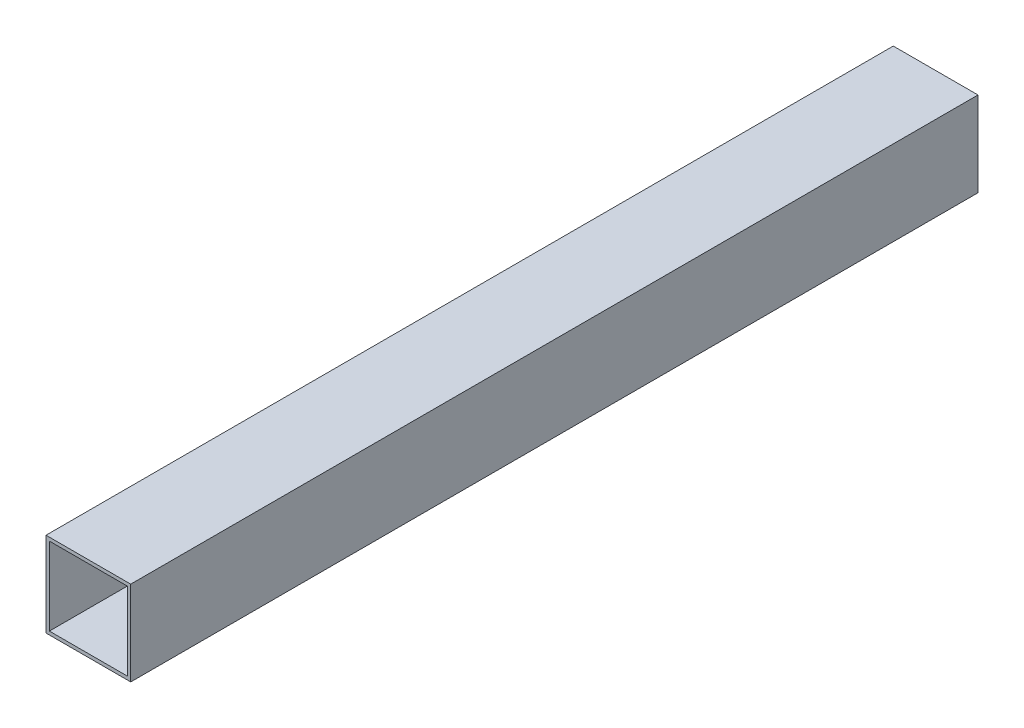
ISO-10303-21;
HEADER;
FILE_DESCRIPTION(('STEP AP214'),'2;1');
FILE_NAME('part.step','',(''),(''),'','','');
FILE_SCHEMA(('AUTOMOTIVE_DESIGN { 1 0 10303 214 1 1 1 1 }'));
ENDSEC;
DATA;
#1=APPLICATION_CONTEXT('core data for automotive mechanical design processes');
#2=APPLICATION_PROTOCOL_DEFINITION('international standard','automotive_design',2000,#1);
#3=PRODUCT_CONTEXT('',#1,'mechanical');
#4=PRODUCT('Part','Part','',(#3));
#5=PRODUCT_RELATED_PRODUCT_CATEGORY('part','',(#4));
#6=PRODUCT_DEFINITION_FORMATION('','',#4);
#7=PRODUCT_DEFINITION_CONTEXT('part definition',#1,'design');
#8=PRODUCT_DEFINITION('design','',#6,#7);
#9=PRODUCT_DEFINITION_SHAPE('','',#8);
#10=(LENGTH_UNIT() NAMED_UNIT(*) SI_UNIT(.MILLI.,.METRE.));
#11=(NAMED_UNIT(*) PLANE_ANGLE_UNIT() SI_UNIT($,.RADIAN.));
#12=(NAMED_UNIT(*) SI_UNIT($,.STERADIAN.) SOLID_ANGLE_UNIT());
#13=UNCERTAINTY_MEASURE_WITH_UNIT(LENGTH_MEASURE(1.E-05),#10,'distance_accuracy_value','');
#14=(GEOMETRIC_REPRESENTATION_CONTEXT(3) GLOBAL_UNCERTAINTY_ASSIGNED_CONTEXT((#13)) GLOBAL_UNIT_ASSIGNED_CONTEXT((#10,
#11,#12)) REPRESENTATION_CONTEXT('',''));
#15=CARTESIAN_POINT('',(0.,0.,0.));
#16=DIRECTION('',(0.,0.,1.));
#17=DIRECTION('',(1.,0.,0.));
#18=AXIS2_PLACEMENT_3D('',#15,#16,#17);
#19=CARTESIAN_POINT('',(-107.863012306017,-68.6292580101181,1000.));
#20=DIRECTION('',(0.,0.,1.));
#21=DIRECTION('',(1.,0.,0.));
#22=AXIS2_PLACEMENT_3D('',#19,#20,#21);
#23=PLANE('',#22);
#24=DIRECTION('',(0.,-1.,0.));
#25=VECTOR('',#24,1.);
#26=CARTESIAN_POINT('',(-107.863012306017,31.370741989882,1000.));
#27=LINE('',#26,#25);
#28=CARTESIAN_POINT('',(-107.863012306017,31.370741989882,1000.));
#29=VERTEX_POINT('',#28);
#30=CARTESIAN_POINT('',(-107.863012306017,-68.6292580101181,1000.));
#31=VERTEX_POINT('',#30);
#32=EDGE_CURVE('E133',#29,#31,#27,.T.);
#33=ORIENTED_EDGE('',*,*,#32,.T.);
#34=DIRECTION('',(1.,0.,0.));
#35=VECTOR('',#34,1.);
#36=CARTESIAN_POINT('',(-107.863012306017,-68.6292580101181,1000.));
#37=LINE('',#36,#35);
#38=CARTESIAN_POINT('',(-7.86301230601749,-68.6292580101181,1000.));
#39=VERTEX_POINT('',#38);
#40=EDGE_CURVE('E136',#31,#39,#37,.T.);
#41=ORIENTED_EDGE('',*,*,#40,.T.);
#42=DIRECTION('',(0.,1.,0.));
#43=VECTOR('',#42,1.);
#44=CARTESIAN_POINT('',(-7.86301230601749,31.370741989882,1000.));
#45=LINE('',#44,#43);
#46=CARTESIAN_POINT('',(-7.86301230601749,31.370741989882,1000.));
#47=VERTEX_POINT('',#46);
#48=EDGE_CURVE('E139',#39,#47,#45,.T.);
#49=ORIENTED_EDGE('',*,*,#48,.T.);
#50=DIRECTION('',(-1.,0.,0.));
#51=VECTOR('',#50,1.);
#52=CARTESIAN_POINT('',(-107.863012306017,31.370741989882,1000.));
#53=LINE('',#52,#51);
#54=EDGE_CURVE('E141',#47,#29,#53,.T.);
#55=ORIENTED_EDGE('',*,*,#54,.T.);
#56=EDGE_LOOP('',(#33,#41,#49,#55));
#57=FACE_BOUND('',#56,.T.);
#58=DIRECTION('',(1.,0.,0.));
#59=VECTOR('',#58,1.);
#60=CARTESIAN_POINT('',(-103.863012306017,-64.629258010118,1000.));
#61=LINE('',#60,#59);
#62=CARTESIAN_POINT('',(-103.863012306017,-64.629258010118,1000.));
#63=VERTEX_POINT('',#62);
#64=CARTESIAN_POINT('',(-11.8630123060175,-64.629258010118,1000.));
#65=VERTEX_POINT('',#64);
#66=EDGE_CURVE('E105',#63,#65,#61,.T.);
#67=ORIENTED_EDGE('',*,*,#66,.F.);
#68=DIRECTION('',(0.,-1.,0.));
#69=VECTOR('',#68,1.);
#70=CARTESIAN_POINT('',(-103.863012306017,27.370741989882,1000.));
#71=LINE('',#70,#69);
#72=CARTESIAN_POINT('',(-103.863012306017,27.370741989882,1000.));
#73=VERTEX_POINT('',#72);
#74=EDGE_CURVE('E97',#73,#63,#71,.T.);
#75=ORIENTED_EDGE('',*,*,#74,.F.);
#76=DIRECTION('',(-1.,0.,0.));
#77=VECTOR('',#76,1.);
#78=CARTESIAN_POINT('',(-103.863012306017,27.370741989882,1000.));
#79=LINE('',#78,#77);
#80=CARTESIAN_POINT('',(-11.8630123060175,27.370741989882,1000.));
#81=VERTEX_POINT('',#80);
#82=EDGE_CURVE('E119',#81,#73,#79,.T.);
#83=ORIENTED_EDGE('',*,*,#82,.F.);
#84=DIRECTION('',(0.,1.,0.));
#85=VECTOR('',#84,1.);
#86=CARTESIAN_POINT('',(-11.8630123060175,27.370741989882,1000.));
#87=LINE('',#86,#85);
#88=EDGE_CURVE('E117',#65,#81,#87,.T.);
#89=ORIENTED_EDGE('',*,*,#88,.F.);
#90=EDGE_LOOP('',(#67,#75,#83,#89));
#91=FACE_BOUND('',#90,.T.);
#92=ADVANCED_FACE('F32',(#57,#91),#23,.T.);
#93=CARTESIAN_POINT('',(-107.863012306017,-68.6292580101181,0.));
#94=DIRECTION('',(0.,0.,1.));
#95=DIRECTION('',(1.,0.,0.));
#96=AXIS2_PLACEMENT_3D('',#93,#94,#95);
#97=PLANE('',#96);
#98=DIRECTION('',(0.,-1.,0.));
#99=VECTOR('',#98,1.);
#100=CARTESIAN_POINT('',(-107.863012306017,31.370741989882,0.));
#101=LINE('',#100,#99);
#102=CARTESIAN_POINT('',(-107.863012306017,31.370741989882,0.));
#103=VERTEX_POINT('',#102);
#104=CARTESIAN_POINT('',(-107.863012306017,-68.6292580101181,0.));
#105=VERTEX_POINT('',#104);
#106=EDGE_CURVE('E113',#103,#105,#101,.T.);
#107=ORIENTED_EDGE('',*,*,#106,.F.);
#108=DIRECTION('',(-1.,0.,0.));
#109=VECTOR('',#108,1.);
#110=CARTESIAN_POINT('',(-107.863012306017,31.370741989882,0.));
#111=LINE('',#110,#109);
#112=CARTESIAN_POINT('',(-7.86301230601749,31.370741989882,0.));
#113=VERTEX_POINT('',#112);
#114=EDGE_CURVE('E137',#113,#103,#111,.T.);
#115=ORIENTED_EDGE('',*,*,#114,.F.);
#116=DIRECTION('',(0.,1.,0.));
#117=VECTOR('',#116,1.);
#118=CARTESIAN_POINT('',(-7.86301230601749,31.370741989882,0.));
#119=LINE('',#118,#117);
#120=CARTESIAN_POINT('',(-7.86301230601749,-68.6292580101181,0.));
#121=VERTEX_POINT('',#120);
#122=EDGE_CURVE('E148',#121,#113,#119,.T.);
#123=ORIENTED_EDGE('',*,*,#122,.F.);
#124=DIRECTION('',(1.,0.,0.));
#125=VECTOR('',#124,1.);
#126=CARTESIAN_POINT('',(-107.863012306017,-68.6292580101181,0.));
#127=LINE('',#126,#125);
#128=EDGE_CURVE('E146',#105,#121,#127,.T.);
#129=ORIENTED_EDGE('',*,*,#128,.F.);
#130=EDGE_LOOP('',(#107,#115,#123,#129));
#131=FACE_BOUND('',#130,.T.);
#132=DIRECTION('',(0.,-1.,0.));
#133=VECTOR('',#132,1.);
#134=CARTESIAN_POINT('',(-103.863012306017,27.370741989882,0.));
#135=LINE('',#134,#133);
#136=CARTESIAN_POINT('',(-103.863012306017,27.370741989882,0.));
#137=VERTEX_POINT('',#136);
#138=CARTESIAN_POINT('',(-103.863012306017,-64.629258010118,0.));
#139=VERTEX_POINT('',#138);
#140=EDGE_CURVE('E55',#137,#139,#135,.T.);
#141=ORIENTED_EDGE('',*,*,#140,.T.);
#142=DIRECTION('',(1.,0.,0.));
#143=VECTOR('',#142,1.);
#144=CARTESIAN_POINT('',(-103.863012306017,-64.629258010118,0.));
#145=LINE('',#144,#143);
#146=CARTESIAN_POINT('',(-11.8630123060175,-64.629258010118,0.));
#147=VERTEX_POINT('',#146);
#148=EDGE_CURVE('E112',#139,#147,#145,.T.);
#149=ORIENTED_EDGE('',*,*,#148,.T.);
#150=DIRECTION('',(0.,1.,0.));
#151=VECTOR('',#150,1.);
#152=CARTESIAN_POINT('',(-11.8630123060175,27.370741989882,0.));
#153=LINE('',#152,#151);
#154=CARTESIAN_POINT('',(-11.8630123060175,27.370741989882,0.));
#155=VERTEX_POINT('',#154);
#156=EDGE_CURVE('E125',#147,#155,#153,.T.);
#157=ORIENTED_EDGE('',*,*,#156,.T.);
#158=DIRECTION('',(-1.,0.,0.));
#159=VECTOR('',#158,1.);
#160=CARTESIAN_POINT('',(-103.863012306017,27.370741989882,0.));
#161=LINE('',#160,#159);
#162=EDGE_CURVE('E106',#155,#137,#161,.T.);
#163=ORIENTED_EDGE('',*,*,#162,.T.);
#164=EDGE_LOOP('',(#141,#149,#157,#163));
#165=FACE_BOUND('',#164,.T.);
#166=ADVANCED_FACE('F166',(#131,#165),#97,.F.);
#167=CARTESIAN_POINT('',(-107.863012306017,31.370741989882,1000.));
#168=DIRECTION('',(1.,0.,0.));
#169=DIRECTION('',(0.,1.,0.));
#170=AXIS2_PLACEMENT_3D('',#167,#168,#169);
#171=PLANE('',#170);
#172=ORIENTED_EDGE('',*,*,#106,.T.);
#173=DIRECTION('',(0.,0.,-1.));
#174=VECTOR('',#173,1.);
#175=CARTESIAN_POINT('',(-107.863012306017,-68.6292580101181,1000.));
#176=LINE('',#175,#174);
#177=EDGE_CURVE('E11',#31,#105,#176,.T.);
#178=ORIENTED_EDGE('',*,*,#177,.F.);
#179=ORIENTED_EDGE('',*,*,#32,.F.);
#180=DIRECTION('',(0.,0.,-1.));
#181=VECTOR('',#180,1.);
#182=CARTESIAN_POINT('',(-107.863012306017,31.370741989882,1000.));
#183=LINE('',#182,#181);
#184=EDGE_CURVE('E143',#29,#103,#183,.T.);
#185=ORIENTED_EDGE('',*,*,#184,.T.);
#186=EDGE_LOOP('',(#172,#178,#179,#185));
#187=FACE_BOUND('',#186,.T.);
#188=ADVANCED_FACE('F34',(#187),#171,.F.);
#189=CARTESIAN_POINT('',(-107.863012306017,-68.6292580101181,1000.));
#190=DIRECTION('',(0.,1.,0.));
#191=DIRECTION('',(0.,0.,1.));
#192=AXIS2_PLACEMENT_3D('',#189,#190,#191);
#193=PLANE('',#192);
#194=ORIENTED_EDGE('',*,*,#128,.T.);
#195=DIRECTION('',(0.,0.,-1.));
#196=VECTOR('',#195,1.);
#197=CARTESIAN_POINT('',(-7.86301230601749,-68.6292580101181,1000.));
#198=LINE('',#197,#196);
#199=EDGE_CURVE('E40',#39,#121,#198,.T.);
#200=ORIENTED_EDGE('',*,*,#199,.F.);
#201=ORIENTED_EDGE('',*,*,#40,.F.);
#202=ORIENTED_EDGE('',*,*,#177,.T.);
#203=EDGE_LOOP('',(#194,#200,#201,#202));
#204=FACE_BOUND('',#203,.T.);
#205=ADVANCED_FACE('F176',(#204),#193,.F.);
#206=CARTESIAN_POINT('',(-7.86301230601749,31.370741989882,1000.));
#207=DIRECTION('',(-1.,0.,0.));
#208=DIRECTION('',(0.,0.,1.));
#209=AXIS2_PLACEMENT_3D('',#206,#207,#208);
#210=PLANE('',#209);
#211=ORIENTED_EDGE('',*,*,#122,.T.);
#212=DIRECTION('',(0.,0.,-1.));
#213=VECTOR('',#212,1.);
#214=CARTESIAN_POINT('',(-7.86301230601749,31.370741989882,1000.));
#215=LINE('',#214,#213);
#216=EDGE_CURVE('E153',#47,#113,#215,.T.);
#217=ORIENTED_EDGE('',*,*,#216,.F.);
#218=ORIENTED_EDGE('',*,*,#48,.F.);
#219=ORIENTED_EDGE('',*,*,#199,.T.);
#220=EDGE_LOOP('',(#211,#217,#218,#219));
#221=FACE_BOUND('',#220,.T.);
#222=ADVANCED_FACE('F160',(#221),#210,.F.);
#223=CARTESIAN_POINT('',(-107.863012306017,31.370741989882,1000.));
#224=DIRECTION('',(0.,-1.,0.));
#225=DIRECTION('',(1.,0.,0.));
#226=AXIS2_PLACEMENT_3D('',#223,#224,#225);
#227=PLANE('',#226);
#228=ORIENTED_EDGE('',*,*,#114,.T.);
#229=ORIENTED_EDGE('',*,*,#184,.F.);
#230=ORIENTED_EDGE('',*,*,#54,.F.);
#231=ORIENTED_EDGE('',*,*,#216,.T.);
#232=EDGE_LOOP('',(#228,#229,#230,#231));
#233=FACE_BOUND('',#232,.T.);
#234=ADVANCED_FACE('F170',(#233),#227,.F.);
#235=CARTESIAN_POINT('',(-103.863012306017,27.370741989882,1000.));
#236=DIRECTION('',(1.,0.,0.));
#237=DIRECTION('',(0.,1.,0.));
#238=AXIS2_PLACEMENT_3D('',#235,#236,#237);
#239=PLANE('',#238);
#240=ORIENTED_EDGE('',*,*,#140,.F.);
#241=DIRECTION('',(0.,0.,-1.));
#242=VECTOR('',#241,1.);
#243=CARTESIAN_POINT('',(-103.863012306017,27.370741989882,1000.));
#244=LINE('',#243,#242);
#245=EDGE_CURVE('E101',#73,#137,#244,.T.);
#246=ORIENTED_EDGE('',*,*,#245,.F.);
#247=ORIENTED_EDGE('',*,*,#74,.T.);
#248=DIRECTION('',(0.,0.,-1.));
#249=VECTOR('',#248,1.);
#250=CARTESIAN_POINT('',(-103.863012306017,-64.629258010118,1000.));
#251=LINE('',#250,#249);
#252=EDGE_CURVE('E100',#63,#139,#251,.T.);
#253=ORIENTED_EDGE('',*,*,#252,.T.);
#254=EDGE_LOOP('',(#240,#246,#247,#253));
#255=FACE_BOUND('',#254,.T.);
#256=ADVANCED_FACE('F99',(#255),#239,.T.);
#257=CARTESIAN_POINT('',(-103.863012306017,-64.629258010118,1000.));
#258=DIRECTION('',(0.,1.,0.));
#259=DIRECTION('',(0.,0.,1.));
#260=AXIS2_PLACEMENT_3D('',#257,#258,#259);
#261=PLANE('',#260);
#262=ORIENTED_EDGE('',*,*,#148,.F.);
#263=ORIENTED_EDGE('',*,*,#252,.F.);
#264=ORIENTED_EDGE('',*,*,#66,.T.);
#265=DIRECTION('',(0.,0.,-1.));
#266=VECTOR('',#265,1.);
#267=CARTESIAN_POINT('',(-11.8630123060175,-64.629258010118,1000.));
#268=LINE('',#267,#266);
#269=EDGE_CURVE('E114',#65,#147,#268,.T.);
#270=ORIENTED_EDGE('',*,*,#269,.T.);
#271=EDGE_LOOP('',(#262,#263,#264,#270));
#272=FACE_BOUND('',#271,.T.);
#273=ADVANCED_FACE('F109',(#272),#261,.T.);
#274=CARTESIAN_POINT('',(-11.8630123060175,27.370741989882,1000.));
#275=DIRECTION('',(-1.,0.,0.));
#276=DIRECTION('',(0.,0.,1.));
#277=AXIS2_PLACEMENT_3D('',#274,#275,#276);
#278=PLANE('',#277);
#279=ORIENTED_EDGE('',*,*,#156,.F.);
#280=ORIENTED_EDGE('',*,*,#269,.F.);
#281=ORIENTED_EDGE('',*,*,#88,.T.);
#282=DIRECTION('',(0.,0.,-1.));
#283=VECTOR('',#282,1.);
#284=CARTESIAN_POINT('',(-11.8630123060175,27.370741989882,1000.));
#285=LINE('',#284,#283);
#286=EDGE_CURVE('E47',#81,#155,#285,.T.);
#287=ORIENTED_EDGE('',*,*,#286,.T.);
#288=EDGE_LOOP('',(#279,#280,#281,#287));
#289=FACE_BOUND('',#288,.T.);
#290=ADVANCED_FACE('F199',(#289),#278,.T.);
#291=CARTESIAN_POINT('',(-103.863012306017,27.370741989882,1000.));
#292=DIRECTION('',(0.,-1.,0.));
#293=DIRECTION('',(0.,0.,-1.));
#294=AXIS2_PLACEMENT_3D('',#291,#292,#293);
#295=PLANE('',#294);
#296=ORIENTED_EDGE('',*,*,#162,.F.);
#297=ORIENTED_EDGE('',*,*,#286,.F.);
#298=ORIENTED_EDGE('',*,*,#82,.T.);
#299=ORIENTED_EDGE('',*,*,#245,.T.);
#300=EDGE_LOOP('',(#296,#297,#298,#299));
#301=FACE_BOUND('',#300,.T.);
#302=ADVANCED_FACE('F203',(#301),#295,.T.);
#303=CLOSED_SHELL('',(#92,#166,#188,#205,#222,#234,#256,#273,#290,#302));
#304=MANIFOLD_SOLID_BREP('B2',#303);
#305=ADVANCED_BREP_SHAPE_REPRESENTATION('',(#18,#304),#14);
#306=SHAPE_DEFINITION_REPRESENTATION(#9,#305);
ENDSEC;
END-ISO-10303-21;
